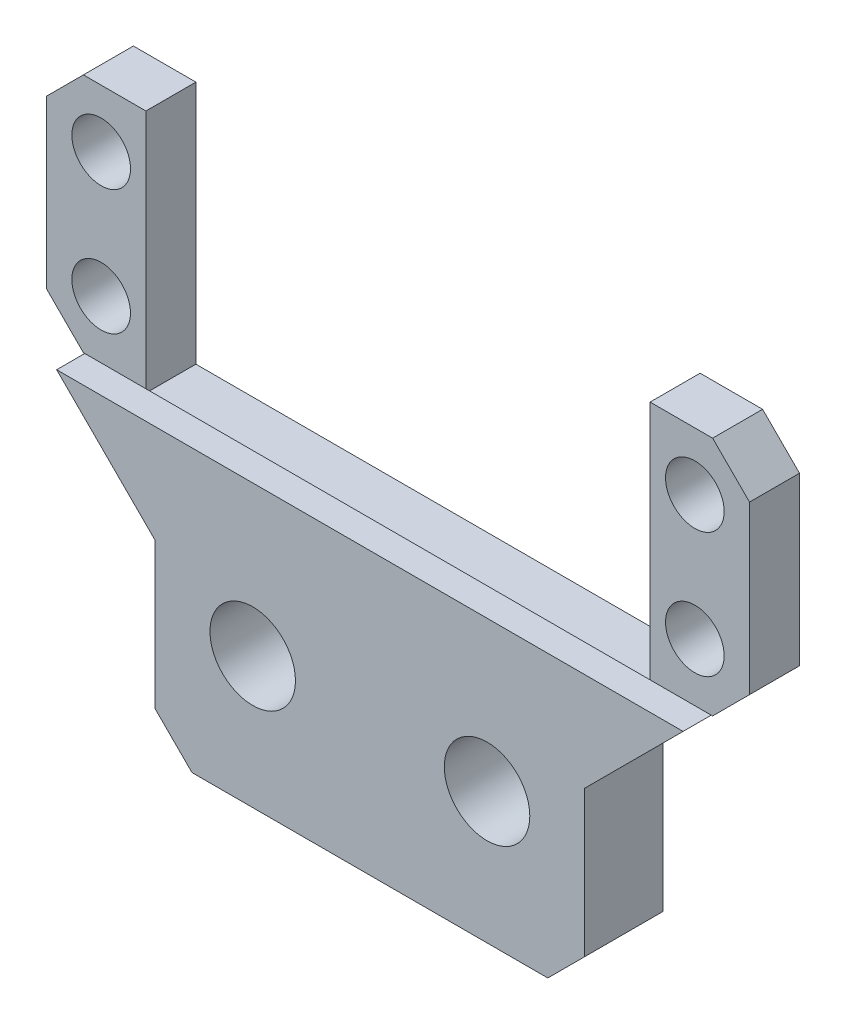
ISO-10303-21;
HEADER;
FILE_DESCRIPTION(('STEP AP214'),'2;1');
FILE_NAME('part.step','',(''),(''),'','','');
FILE_SCHEMA(('AUTOMOTIVE_DESIGN { 1 0 10303 214 1 1 1 1 }'));
ENDSEC;
DATA;
#1=APPLICATION_CONTEXT('core data for automotive mechanical design processes');
#2=APPLICATION_PROTOCOL_DEFINITION('international standard','automotive_design',2000,#1);
#3=PRODUCT_CONTEXT('',#1,'mechanical');
#4=PRODUCT('Part','Part','',(#3));
#5=PRODUCT_RELATED_PRODUCT_CATEGORY('part','',(#4));
#6=PRODUCT_DEFINITION_FORMATION('','',#4);
#7=PRODUCT_DEFINITION_CONTEXT('part definition',#1,'design');
#8=PRODUCT_DEFINITION('design','',#6,#7);
#9=PRODUCT_DEFINITION_SHAPE('','',#8);
#10=(LENGTH_UNIT() NAMED_UNIT(*) SI_UNIT(.MILLI.,.METRE.));
#11=(NAMED_UNIT(*) PLANE_ANGLE_UNIT() SI_UNIT($,.RADIAN.));
#12=(NAMED_UNIT(*) SI_UNIT($,.STERADIAN.) SOLID_ANGLE_UNIT());
#13=UNCERTAINTY_MEASURE_WITH_UNIT(LENGTH_MEASURE(1.E-05),#10,'distance_accuracy_value','');
#14=(GEOMETRIC_REPRESENTATION_CONTEXT(3) GLOBAL_UNCERTAINTY_ASSIGNED_CONTEXT((#13)) GLOBAL_UNIT_ASSIGNED_CONTEXT((#10,
#11,#12)) REPRESENTATION_CONTEXT('',''));
#15=CARTESIAN_POINT('',(0.,0.,0.));
#16=DIRECTION('',(0.,0.,1.));
#17=DIRECTION('',(1.,0.,0.));
#18=AXIS2_PLACEMENT_3D('',#15,#16,#17);
#19=CARTESIAN_POINT('',(0.,21.209,6.35));
#20=DIRECTION('',(0.,-1.,0.));
#21=DIRECTION('',(0.,0.,-1.));
#22=AXIS2_PLACEMENT_3D('',#19,#20,#21);
#23=PLANE('',#22);
#24=DIRECTION('',(-1.,0.,0.));
#25=VECTOR('',#24,1.);
#26=CARTESIAN_POINT('',(25.575,21.209,4.064));
#27=LINE('',#26,#25);
#28=CARTESIAN_POINT('',(-20.493,21.209,4.064));
#29=VERTEX_POINT('',#28);
#30=CARTESIAN_POINT('',(-25.575,21.209,4.064));
#31=VERTEX_POINT('',#30);
#32=EDGE_CURVE('E233',#29,#31,#27,.T.);
#33=ORIENTED_EDGE('',*,*,#32,.F.);
#34=DIRECTION('',(0.,0.,-1.));
#35=VECTOR('',#34,1.);
#36=CARTESIAN_POINT('',(-20.493,21.209,6.35));
#37=LINE('',#36,#35);
#38=CARTESIAN_POINT('',(-20.493,21.209,0.));
#39=VERTEX_POINT('',#38);
#40=EDGE_CURVE('E219',#29,#39,#37,.T.);
#41=ORIENTED_EDGE('',*,*,#40,.T.);
#42=DIRECTION('',(-1.,0.,0.));
#43=VECTOR('',#42,1.);
#44=CARTESIAN_POINT('',(0.,21.209,0.));
#45=LINE('',#44,#43);
#46=CARTESIAN_POINT('',(-25.575,21.209,0.));
#47=VERTEX_POINT('',#46);
#48=EDGE_CURVE('E204',#39,#47,#45,.T.);
#49=ORIENTED_EDGE('',*,*,#48,.T.);
#50=DIRECTION('',(0.,0.,1.));
#51=VECTOR('',#50,1.);
#52=CARTESIAN_POINT('',(-25.575,21.209,6.35));
#53=LINE('',#52,#51);
#54=EDGE_CURVE('E341',#47,#31,#53,.T.);
#55=ORIENTED_EDGE('',*,*,#54,.T.);
#56=EDGE_LOOP('',(#33,#41,#49,#55));
#57=FACE_BOUND('',#56,.T.);
#58=ADVANCED_FACE('F33',(#57),#23,.F.);
#59=CARTESIAN_POINT('',(0.,0.,4.064));
#60=DIRECTION('',(0.,0.,1.));
#61=DIRECTION('',(1.,0.,0.));
#62=AXIS2_PLACEMENT_3D('',#59,#60,#61);
#63=PLANE('',#62);
#64=DIRECTION('',(0.,-1.,0.));
#65=VECTOR('',#64,1.);
#66=CARTESIAN_POINT('',(-20.493,1.35099999999998,4.064));
#67=LINE('',#66,#65);
#68=CARTESIAN_POINT('',(-20.493,1.6509999999999,4.064));
#69=VERTEX_POINT('',#68);
#70=EDGE_CURVE('E48',#29,#69,#67,.T.);
#71=ORIENTED_EDGE('',*,*,#70,.F.);
#72=ORIENTED_EDGE('',*,*,#32,.T.);
#73=DIRECTION('',(-0.707106781186548,-0.707106781186547,0.));
#74=VECTOR('',#73,1.);
#75=CARTESIAN_POINT('',(-25.575,21.209,4.064));
#76=LINE('',#75,#74);
#77=CARTESIAN_POINT('',(-28.575,18.209,4.064));
#78=VERTEX_POINT('',#77);
#79=EDGE_CURVE('E237',#31,#78,#76,.T.);
#80=ORIENTED_EDGE('',*,*,#79,.T.);
#81=DIRECTION('',(0.,-1.,0.));
#82=VECTOR('',#81,1.);
#83=CARTESIAN_POINT('',(-28.575,18.209,4.064));
#84=LINE('',#83,#82);
#85=CARTESIAN_POINT('',(-28.575,4.65099999999999,4.064));
#86=VERTEX_POINT('',#85);
#87=EDGE_CURVE('E239',#78,#86,#84,.T.);
#88=ORIENTED_EDGE('',*,*,#87,.T.);
#89=DIRECTION('',(0.707106781186546,-0.707106781186549,0.));
#90=VECTOR('',#89,1.);
#91=CARTESIAN_POINT('',(-28.575,4.65099999999999,4.064));
#92=LINE('',#91,#90);
#93=CARTESIAN_POINT('',(-25.575,1.65099999999999,4.064));
#94=VERTEX_POINT('',#93);
#95=EDGE_CURVE('E241',#86,#94,#92,.T.);
#96=ORIENTED_EDGE('',*,*,#95,.T.);
#97=DIRECTION('',(1.,0.,0.));
#98=VECTOR('',#97,1.);
#99=CARTESIAN_POINT('',(25.4625,1.65099999999999,4.064));
#100=LINE('',#99,#98);
#101=CARTESIAN_POINT('',(-25.4624999999999,1.65099999999989,4.064));
#102=VERTEX_POINT('',#101);
#103=EDGE_CURVE('E222',#94,#102,#100,.T.);
#104=ORIENTED_EDGE('',*,*,#103,.T.);
#105=EDGE_CURVE('E226',#102,#69,#100,.T.);
#106=ORIENTED_EDGE('',*,*,#105,.T.);
#107=EDGE_LOOP('',(#71,#72,#80,#88,#96,#104,#106));
#108=FACE_BOUND('',#107,.T.);
#109=CARTESIAN_POINT('',(-24.13,16.51,4.064));
#110=DIRECTION('',(0.,0.,1.));
#111=DIRECTION('',(1.,0.,0.));
#112=AXIS2_PLACEMENT_3D('',#109,#110,#111);
#113=CIRCLE('',#112,2.3828);
#114=CARTESIAN_POINT('',(-21.7472,16.51,4.064));
#115=VERTEX_POINT('',#114);
#116=EDGE_CURVE('E251',#115,#115,#113,.F.);
#117=ORIENTED_EDGE('',*,*,#116,.T.);
#118=EDGE_LOOP('',(#117));
#119=FACE_BOUND('',#118,.T.);
#120=CARTESIAN_POINT('',(-24.13,6.34999999999999,4.064));
#121=DIRECTION('',(0.,0.,1.));
#122=DIRECTION('',(1.,0.,0.));
#123=AXIS2_PLACEMENT_3D('',#120,#121,#122);
#124=CIRCLE('',#123,2.3828);
#125=CARTESIAN_POINT('',(-21.7472,6.34999999999999,4.064));
#126=VERTEX_POINT('',#125);
#127=EDGE_CURVE('E254',#126,#126,#124,.T.);
#128=ORIENTED_EDGE('',*,*,#127,.F.);
#129=EDGE_LOOP('',(#128));
#130=FACE_BOUND('',#129,.T.);
#131=ADVANCED_FACE('F415',(#108,#119,#130),#63,.T.);
#132=CARTESIAN_POINT('',(0.,1.65099999999999,6.35));
#133=DIRECTION('',(0.,-1.,0.));
#134=DIRECTION('',(1.,0.,0.));
#135=AXIS2_PLACEMENT_3D('',#132,#133,#134);
#136=PLANE('',#135);
#137=DIRECTION('',(0.,0.,1.));
#138=VECTOR('',#137,1.);
#139=CARTESIAN_POINT('',(-25.4625,1.65099999999999,6.35));
#140=LINE('',#139,#138);
#141=CARTESIAN_POINT('',(-25.4625,1.65099999999999,0.));
#142=VERTEX_POINT('',#141);
#143=EDGE_CURVE('E364',#142,#102,#140,.T.);
#144=ORIENTED_EDGE('',*,*,#143,.T.);
#145=ORIENTED_EDGE('',*,*,#103,.F.);
#146=DIRECTION('',(0.,0.,-1.));
#147=VECTOR('',#146,1.);
#148=CARTESIAN_POINT('',(-25.575,1.65099999999999,6.35));
#149=LINE('',#148,#147);
#150=CARTESIAN_POINT('',(-25.575,1.65099999999999,0.));
#151=VERTEX_POINT('',#150);
#152=EDGE_CURVE('E354',#94,#151,#149,.T.);
#153=ORIENTED_EDGE('',*,*,#152,.T.);
#154=DIRECTION('',(-1.,0.,0.));
#155=VECTOR('',#154,1.);
#156=CARTESIAN_POINT('',(0.,1.65099999999999,0.));
#157=LINE('',#156,#155);
#158=EDGE_CURVE('E283',#142,#151,#157,.T.);
#159=ORIENTED_EDGE('',*,*,#158,.F.);
#160=EDGE_LOOP('',(#144,#145,#153,#159));
#161=FACE_BOUND('',#160,.T.);
#162=ADVANCED_FACE('F394',(#161),#136,.T.);
#163=CARTESIAN_POINT('',(0.,1.651,6.35));
#164=DIRECTION('',(0.,-1.,0.));
#165=DIRECTION('',(1.,0.,0.));
#166=AXIS2_PLACEMENT_3D('',#163,#164,#165);
#167=PLANE('',#166);
#168=DIRECTION('',(0.,0.,1.));
#169=VECTOR('',#168,1.);
#170=CARTESIAN_POINT('',(25.575,1.65099999999999,6.35));
#171=LINE('',#170,#169);
#172=CARTESIAN_POINT('',(25.575,1.65099999999999,0.));
#173=VERTEX_POINT('',#172);
#174=CARTESIAN_POINT('',(25.575,1.65099999999999,4.064));
#175=VERTEX_POINT('',#174);
#176=EDGE_CURVE('E351',#173,#175,#171,.T.);
#177=ORIENTED_EDGE('',*,*,#176,.T.);
#178=CARTESIAN_POINT('',(25.4625,1.65099999999999,4.064));
#179=VERTEX_POINT('',#178);
#180=EDGE_CURVE('E245',#179,#175,#100,.T.);
#181=ORIENTED_EDGE('',*,*,#180,.F.);
#182=DIRECTION('',(0.,0.,-1.));
#183=VECTOR('',#182,1.);
#184=CARTESIAN_POINT('',(25.4625,1.65099999999999,6.35));
#185=LINE('',#184,#183);
#186=CARTESIAN_POINT('',(25.4625,1.65099999999999,0.));
#187=VERTEX_POINT('',#186);
#188=EDGE_CURVE('E367',#179,#187,#185,.T.);
#189=ORIENTED_EDGE('',*,*,#188,.T.);
#190=DIRECTION('',(-1.,0.,0.));
#191=VECTOR('',#190,1.);
#192=CARTESIAN_POINT('',(0.,1.651,0.));
#193=LINE('',#192,#191);
#194=EDGE_CURVE('E294',#173,#187,#193,.T.);
#195=ORIENTED_EDGE('',*,*,#194,.F.);
#196=EDGE_LOOP('',(#177,#181,#189,#195));
#197=FACE_BOUND('',#196,.T.);
#198=ADVANCED_FACE('F433',(#197),#167,.T.);
#199=CARTESIAN_POINT('',(28.575,0.,6.35));
#200=DIRECTION('',(-1.,0.,0.));
#201=DIRECTION('',(0.,0.,1.));
#202=AXIS2_PLACEMENT_3D('',#199,#200,#201);
#203=PLANE('',#202);
#204=DIRECTION('',(0.,1.,0.));
#205=VECTOR('',#204,1.);
#206=CARTESIAN_POINT('',(28.575,4.65099999999998,4.064));
#207=LINE('',#206,#205);
#208=CARTESIAN_POINT('',(28.575,4.65099999999998,4.064));
#209=VERTEX_POINT('',#208);
#210=CARTESIAN_POINT('',(28.575,18.209,4.064));
#211=VERTEX_POINT('',#210);
#212=EDGE_CURVE('E229',#209,#211,#207,.T.);
#213=ORIENTED_EDGE('',*,*,#212,.F.);
#214=DIRECTION('',(0.,0.,-1.));
#215=VECTOR('',#214,1.);
#216=CARTESIAN_POINT('',(28.575,4.65099999999998,0.));
#217=LINE('',#216,#215);
#218=CARTESIAN_POINT('',(28.575,4.65099999999998,0.));
#219=VERTEX_POINT('',#218);
#220=EDGE_CURVE('E346',#209,#219,#217,.T.);
#221=ORIENTED_EDGE('',*,*,#220,.T.);
#222=DIRECTION('',(0.,1.,0.));
#223=VECTOR('',#222,1.);
#224=CARTESIAN_POINT('',(28.575,0.,0.));
#225=LINE('',#224,#223);
#226=CARTESIAN_POINT('',(28.575,18.209,0.));
#227=VERTEX_POINT('',#226);
#228=EDGE_CURVE('E296',#219,#227,#225,.T.);
#229=ORIENTED_EDGE('',*,*,#228,.T.);
#230=DIRECTION('',(0.,0.,1.));
#231=VECTOR('',#230,1.);
#232=CARTESIAN_POINT('',(28.575,18.209,6.35));
#233=LINE('',#232,#231);
#234=EDGE_CURVE('E348',#227,#211,#233,.T.);
#235=ORIENTED_EDGE('',*,*,#234,.T.);
#236=EDGE_LOOP('',(#213,#221,#229,#235));
#237=FACE_BOUND('',#236,.T.);
#238=ADVANCED_FACE('F445',(#237),#203,.F.);
#239=CARTESIAN_POINT('',(25.575,21.209,0.));
#240=VERTEX_POINT('',#239);
#241=CARTESIAN_POINT('',(20.493,21.209,0.));
#242=VERTEX_POINT('',#241);
#243=EDGE_CURVE('E299',#240,#242,#45,.T.);
#244=ORIENTED_EDGE('',*,*,#243,.T.);
#245=DIRECTION('',(0.,0.,1.));
#246=VECTOR('',#245,1.);
#247=CARTESIAN_POINT('',(20.493,21.209,6.35));
#248=LINE('',#247,#246);
#249=CARTESIAN_POINT('',(20.493,21.209,4.064));
#250=VERTEX_POINT('',#249);
#251=EDGE_CURVE('E215',#242,#250,#248,.T.);
#252=ORIENTED_EDGE('',*,*,#251,.T.);
#253=CARTESIAN_POINT('',(25.575,21.209,4.064));
#254=VERTEX_POINT('',#253);
#255=EDGE_CURVE('E234',#254,#250,#27,.T.);
#256=ORIENTED_EDGE('',*,*,#255,.F.);
#257=DIRECTION('',(0.,0.,-1.));
#258=VECTOR('',#257,1.);
#259=CARTESIAN_POINT('',(25.575,21.209,6.35));
#260=LINE('',#259,#258);
#261=EDGE_CURVE('E344',#254,#240,#260,.T.);
#262=ORIENTED_EDGE('',*,*,#261,.T.);
#263=EDGE_LOOP('',(#244,#252,#256,#262));
#264=FACE_BOUND('',#263,.T.);
#265=ADVANCED_FACE('F454',(#264),#23,.F.);
#266=CARTESIAN_POINT('',(24.13,16.51,6.35));
#267=DIRECTION('',(0.,0.,-1.));
#268=DIRECTION('',(-1.,0.,0.));
#269=AXIS2_PLACEMENT_3D('',#266,#267,#268);
#270=CYLINDRICAL_SURFACE('',#269,2.3828);
#271=CARTESIAN_POINT('',(24.13,16.51,0.));
#272=DIRECTION('',(0.,0.,1.));
#273=DIRECTION('',(1.,0.,0.));
#274=AXIS2_PLACEMENT_3D('',#271,#272,#273);
#275=CIRCLE('',#274,2.3828);
#276=CARTESIAN_POINT('',(26.5128,16.51,0.));
#277=VERTEX_POINT('',#276);
#278=EDGE_CURVE('E311',#277,#277,#275,.T.);
#279=ORIENTED_EDGE('',*,*,#278,.F.);
#280=EDGE_LOOP('',(#279));
#281=FACE_BOUND('',#280,.T.);
#282=CARTESIAN_POINT('',(24.13,16.51,4.064));
#283=DIRECTION('',(0.,0.,1.));
#284=DIRECTION('',(1.,0.,0.));
#285=AXIS2_PLACEMENT_3D('',#282,#283,#284);
#286=CIRCLE('',#285,2.3828);
#287=CARTESIAN_POINT('',(26.5128,16.51,4.064));
#288=VERTEX_POINT('',#287);
#289=EDGE_CURVE('E257',#288,#288,#286,.T.);
#290=ORIENTED_EDGE('',*,*,#289,.T.);
#291=EDGE_LOOP('',(#290));
#292=FACE_BOUND('',#291,.T.);
#293=ADVANCED_FACE('F477',(#281,#292),#270,.F.);
#294=CARTESIAN_POINT('',(-28.575,0.,6.35));
#295=DIRECTION('',(-1.,0.,0.));
#296=DIRECTION('',(0.,0.,1.));
#297=AXIS2_PLACEMENT_3D('',#294,#295,#296);
#298=PLANE('',#297);
#299=DIRECTION('',(0.,0.,1.));
#300=VECTOR('',#299,1.);
#301=CARTESIAN_POINT('',(-28.575,4.65099999999999,6.35));
#302=LINE('',#301,#300);
#303=CARTESIAN_POINT('',(-28.575,4.65099999999999,0.));
#304=VERTEX_POINT('',#303);
#305=EDGE_CURVE('E358',#304,#86,#302,.T.);
#306=ORIENTED_EDGE('',*,*,#305,.T.);
#307=ORIENTED_EDGE('',*,*,#87,.F.);
#308=DIRECTION('',(0.,0.,-1.));
#309=VECTOR('',#308,1.);
#310=CARTESIAN_POINT('',(-28.575,18.209,0.));
#311=LINE('',#310,#309);
#312=CARTESIAN_POINT('',(-28.575,18.209,0.));
#313=VERTEX_POINT('',#312);
#314=EDGE_CURVE('E356',#78,#313,#311,.T.);
#315=ORIENTED_EDGE('',*,*,#314,.T.);
#316=DIRECTION('',(0.,1.,0.));
#317=VECTOR('',#316,1.);
#318=CARTESIAN_POINT('',(-28.575,0.,0.));
#319=LINE('',#318,#317);
#320=EDGE_CURVE('E302',#304,#313,#319,.T.);
#321=ORIENTED_EDGE('',*,*,#320,.F.);
#322=EDGE_LOOP('',(#306,#307,#315,#321));
#323=FACE_BOUND('',#322,.T.);
#324=ADVANCED_FACE('F403',(#323),#298,.T.);
#325=CARTESIAN_POINT('',(-24.13,6.34999999999999,6.35));
#326=DIRECTION('',(0.,0.,-1.));
#327=DIRECTION('',(-1.,0.,0.));
#328=AXIS2_PLACEMENT_3D('',#325,#326,#327);
#329=CYLINDRICAL_SURFACE('',#328,2.3828);
#330=CARTESIAN_POINT('',(-24.13,6.34999999999999,0.));
#331=DIRECTION('',(0.,0.,1.));
#332=DIRECTION('',(1.,0.,0.));
#333=AXIS2_PLACEMENT_3D('',#330,#331,#332);
#334=CIRCLE('',#333,2.3828);
#335=CARTESIAN_POINT('',(-21.7472,6.34999999999999,0.));
#336=VERTEX_POINT('',#335);
#337=EDGE_CURVE('E280',#336,#336,#334,.T.);
#338=ORIENTED_EDGE('',*,*,#337,.F.);
#339=EDGE_LOOP('',(#338));
#340=FACE_BOUND('',#339,.T.);
#341=ORIENTED_EDGE('',*,*,#127,.T.);
#342=EDGE_LOOP('',(#341));
#343=FACE_BOUND('',#342,.T.);
#344=ADVANCED_FACE('F502',(#340,#343),#329,.F.);
#345=CARTESIAN_POINT('',(-24.13,16.51,6.35));
#346=DIRECTION('',(0.,0.,-1.));
#347=DIRECTION('',(-1.,0.,0.));
#348=AXIS2_PLACEMENT_3D('',#345,#346,#347);
#349=CYLINDRICAL_SURFACE('',#348,2.3828);
#350=CARTESIAN_POINT('',(-24.13,16.51,0.));
#351=DIRECTION('',(0.,0.,1.));
#352=DIRECTION('',(1.,0.,0.));
#353=AXIS2_PLACEMENT_3D('',#350,#351,#352);
#354=CIRCLE('',#353,2.3828);
#355=CARTESIAN_POINT('',(-21.7472,16.51,0.));
#356=VERTEX_POINT('',#355);
#357=EDGE_CURVE('E260',#356,#356,#354,.F.);
#358=ORIENTED_EDGE('',*,*,#357,.T.);
#359=EDGE_LOOP('',(#358));
#360=FACE_BOUND('',#359,.T.);
#361=ORIENTED_EDGE('',*,*,#116,.F.);
#362=EDGE_LOOP('',(#361));
#363=FACE_BOUND('',#362,.T.);
#364=ADVANCED_FACE('F505',(#360,#363),#349,.F.);
#365=CARTESIAN_POINT('',(24.13,6.34999999999999,6.35));
#366=DIRECTION('',(0.,0.,-1.));
#367=DIRECTION('',(-1.,0.,0.));
#368=AXIS2_PLACEMENT_3D('',#365,#366,#367);
#369=CYLINDRICAL_SURFACE('',#368,2.3828);
#370=CARTESIAN_POINT('',(24.13,6.34999999999999,0.));
#371=DIRECTION('',(0.,0.,1.));
#372=DIRECTION('',(1.,0.,0.));
#373=AXIS2_PLACEMENT_3D('',#370,#371,#372);
#374=CIRCLE('',#373,2.3828);
#375=CARTESIAN_POINT('',(26.5128,6.34999999999999,0.));
#376=VERTEX_POINT('',#375);
#377=EDGE_CURVE('E265',#376,#376,#374,.F.);
#378=ORIENTED_EDGE('',*,*,#377,.T.);
#379=EDGE_LOOP('',(#378));
#380=FACE_BOUND('',#379,.T.);
#381=CARTESIAN_POINT('',(24.13,6.34999999999999,4.064));
#382=DIRECTION('',(0.,0.,1.));
#383=DIRECTION('',(1.,0.,0.));
#384=AXIS2_PLACEMENT_3D('',#381,#382,#383);
#385=CIRCLE('',#384,2.3828);
#386=CARTESIAN_POINT('',(26.5128,6.34999999999999,4.064));
#387=VERTEX_POINT('',#386);
#388=EDGE_CURVE('E248',#387,#387,#385,.F.);
#389=ORIENTED_EDGE('',*,*,#388,.F.);
#390=EDGE_LOOP('',(#389));
#391=FACE_BOUND('',#390,.T.);
#392=ADVANCED_FACE('F509',(#380,#391),#369,.F.);
#393=CARTESIAN_POINT('',(25.575,21.209,6.35));
#394=DIRECTION('',(-0.707106781186548,-0.707106781186547,0.));
#395=DIRECTION('',(0.,0.,-1.));
#396=AXIS2_PLACEMENT_3D('',#393,#394,#395);
#397=PLANE('',#396);
#398=ORIENTED_EDGE('',*,*,#261,.F.);
#399=DIRECTION('',(-0.707106781186547,0.707106781186548,0.));
#400=VECTOR('',#399,1.);
#401=CARTESIAN_POINT('',(28.575,18.209,4.064));
#402=LINE('',#401,#400);
#403=EDGE_CURVE('E231',#211,#254,#402,.T.);
#404=ORIENTED_EDGE('',*,*,#403,.F.);
#405=ORIENTED_EDGE('',*,*,#234,.F.);
#406=DIRECTION('',(-0.707106781186547,0.707106781186548,0.));
#407=VECTOR('',#406,1.);
#408=CARTESIAN_POINT('',(25.575,21.209,0.));
#409=LINE('',#408,#407);
#410=EDGE_CURVE('E326',#240,#227,#409,.F.);
#411=ORIENTED_EDGE('',*,*,#410,.F.);
#412=EDGE_LOOP('',(#398,#404,#405,#411));
#413=FACE_BOUND('',#412,.T.);
#414=ADVANCED_FACE('F450',(#413),#397,.F.);
#415=CARTESIAN_POINT('',(28.575,4.65099999999998,6.35));
#416=DIRECTION('',(0.707106781186545,-0.70710678118655,0.));
#417=DIRECTION('',(0.,0.,1.));
#418=AXIS2_PLACEMENT_3D('',#415,#416,#417);
#419=PLANE('',#418);
#420=ORIENTED_EDGE('',*,*,#220,.F.);
#421=DIRECTION('',(0.70710678118655,0.707106781186545,0.));
#422=VECTOR('',#421,1.);
#423=CARTESIAN_POINT('',(25.575,1.65099999999999,4.064));
#424=LINE('',#423,#422);
#425=EDGE_CURVE('E225',#175,#209,#424,.T.);
#426=ORIENTED_EDGE('',*,*,#425,.F.);
#427=ORIENTED_EDGE('',*,*,#176,.F.);
#428=DIRECTION('',(-0.70710678118655,-0.707106781186545,0.));
#429=VECTOR('',#428,1.);
#430=CARTESIAN_POINT('',(28.575,4.65099999999998,0.));
#431=LINE('',#430,#429);
#432=EDGE_CURVE('E324',#219,#173,#431,.T.);
#433=ORIENTED_EDGE('',*,*,#432,.F.);
#434=EDGE_LOOP('',(#420,#426,#427,#433));
#435=FACE_BOUND('',#434,.T.);
#436=ADVANCED_FACE('F441',(#435),#419,.T.);
#437=CARTESIAN_POINT('',(-25.575,1.65099999999999,6.35));
#438=DIRECTION('',(0.707106781186549,0.707106781186546,0.));
#439=DIRECTION('',(0.,0.,-1.));
#440=AXIS2_PLACEMENT_3D('',#437,#438,#439);
#441=PLANE('',#440);
#442=ORIENTED_EDGE('',*,*,#152,.F.);
#443=ORIENTED_EDGE('',*,*,#95,.F.);
#444=ORIENTED_EDGE('',*,*,#305,.F.);
#445=DIRECTION('',(0.707106781186546,-0.707106781186549,0.));
#446=VECTOR('',#445,1.);
#447=CARTESIAN_POINT('',(-25.575,1.65099999999999,0.));
#448=LINE('',#447,#446);
#449=EDGE_CURVE('E322',#151,#304,#448,.F.);
#450=ORIENTED_EDGE('',*,*,#449,.F.);
#451=EDGE_LOOP('',(#442,#443,#444,#450));
#452=FACE_BOUND('',#451,.T.);
#453=ADVANCED_FACE('F399',(#452),#441,.F.);
#454=CARTESIAN_POINT('',(-28.575,18.209,6.35));
#455=DIRECTION('',(-0.707106781186547,0.707106781186548,0.));
#456=DIRECTION('',(0.,0.,1.));
#457=AXIS2_PLACEMENT_3D('',#454,#455,#456);
#458=PLANE('',#457);
#459=ORIENTED_EDGE('',*,*,#314,.F.);
#460=ORIENTED_EDGE('',*,*,#79,.F.);
#461=ORIENTED_EDGE('',*,*,#54,.F.);
#462=DIRECTION('',(0.707106781186548,0.707106781186547,0.));
#463=VECTOR('',#462,1.);
#464=CARTESIAN_POINT('',(-28.575,18.209,0.));
#465=LINE('',#464,#463);
#466=EDGE_CURVE('E320',#313,#47,#465,.T.);
#467=ORIENTED_EDGE('',*,*,#466,.F.);
#468=EDGE_LOOP('',(#459,#460,#461,#467));
#469=FACE_BOUND('',#468,.T.);
#470=ADVANCED_FACE('F410',(#469),#458,.T.);
#471=CARTESIAN_POINT('',(-17.4625,0.,6.35));
#472=DIRECTION('',(-1.,0.,0.));
#473=DIRECTION('',(0.,0.,1.));
#474=AXIS2_PLACEMENT_3D('',#471,#472,#473);
#475=PLANE('',#474);
#476=DIRECTION('',(0.,1.,0.));
#477=VECTOR('',#476,1.);
#478=CARTESIAN_POINT('',(-17.4625,0.,6.35));
#479=LINE('',#478,#477);
#480=CARTESIAN_POINT('',(-17.4625,-18.209,6.35));
#481=VERTEX_POINT('',#480);
#482=CARTESIAN_POINT('',(-17.4625,-6.34900000000007,6.35));
#483=VERTEX_POINT('',#482);
#484=EDGE_CURVE('E261',#481,#483,#479,.T.);
#485=ORIENTED_EDGE('',*,*,#484,.T.);
#486=DIRECTION('',(0.,0.,-1.));
#487=VECTOR('',#486,1.);
#488=CARTESIAN_POINT('',(-17.4625,-6.34900000000007,0.));
#489=LINE('',#488,#487);
#490=CARTESIAN_POINT('',(-17.4625,-6.34900000000007,0.));
#491=VERTEX_POINT('',#490);
#492=EDGE_CURVE('E361',#483,#491,#489,.T.);
#493=ORIENTED_EDGE('',*,*,#492,.T.);
#494=DIRECTION('',(0.,1.,0.));
#495=VECTOR('',#494,1.);
#496=CARTESIAN_POINT('',(-17.4625,0.,0.));
#497=LINE('',#496,#495);
#498=CARTESIAN_POINT('',(-17.4625,-18.209,0.));
#499=VERTEX_POINT('',#498);
#500=EDGE_CURVE('E286',#499,#491,#497,.T.);
#501=ORIENTED_EDGE('',*,*,#500,.F.);
#502=DIRECTION('',(0.,0.,1.));
#503=VECTOR('',#502,1.);
#504=CARTESIAN_POINT('',(-17.4625,-18.209,6.35));
#505=LINE('',#504,#503);
#506=EDGE_CURVE('E332',#499,#481,#505,.T.);
#507=ORIENTED_EDGE('',*,*,#506,.T.);
#508=EDGE_LOOP('',(#485,#493,#501,#507));
#509=FACE_BOUND('',#508,.T.);
#510=ADVANCED_FACE('F386',(#509),#475,.T.);
#511=CARTESIAN_POINT('',(0.,-21.209,6.35));
#512=DIRECTION('',(0.,-1.,0.));
#513=DIRECTION('',(1.,0.,0.));
#514=AXIS2_PLACEMENT_3D('',#511,#512,#513);
#515=PLANE('',#514);
#516=DIRECTION('',(-1.,0.,0.));
#517=VECTOR('',#516,1.);
#518=CARTESIAN_POINT('',(0.,-21.209,6.35));
#519=LINE('',#518,#517);
#520=CARTESIAN_POINT('',(14.4625,-21.209,6.35));
#521=VERTEX_POINT('',#520);
#522=CARTESIAN_POINT('',(-14.4625,-21.209,6.35));
#523=VERTEX_POINT('',#522);
#524=EDGE_CURVE('E264',#521,#523,#519,.T.);
#525=ORIENTED_EDGE('',*,*,#524,.T.);
#526=DIRECTION('',(0.,0.,-1.));
#527=VECTOR('',#526,1.);
#528=CARTESIAN_POINT('',(-14.4625,-21.209,6.35));
#529=LINE('',#528,#527);
#530=CARTESIAN_POINT('',(-14.4625,-21.209,0.));
#531=VERTEX_POINT('',#530);
#532=EDGE_CURVE('E317',#523,#531,#529,.T.);
#533=ORIENTED_EDGE('',*,*,#532,.T.);
#534=DIRECTION('',(-1.,0.,0.));
#535=VECTOR('',#534,1.);
#536=CARTESIAN_POINT('',(0.,-21.209,0.));
#537=LINE('',#536,#535);
#538=CARTESIAN_POINT('',(14.4625,-21.209,0.));
#539=VERTEX_POINT('',#538);
#540=EDGE_CURVE('E289',#539,#531,#537,.T.);
#541=ORIENTED_EDGE('',*,*,#540,.F.);
#542=DIRECTION('',(0.,0.,1.));
#543=VECTOR('',#542,1.);
#544=CARTESIAN_POINT('',(14.4625,-21.209,6.35));
#545=LINE('',#544,#543);
#546=EDGE_CURVE('E277',#539,#521,#545,.T.);
#547=ORIENTED_EDGE('',*,*,#546,.T.);
#548=EDGE_LOOP('',(#525,#533,#541,#547));
#549=FACE_BOUND('',#548,.T.);
#550=ADVANCED_FACE('F493',(#549),#515,.T.);
#551=CARTESIAN_POINT('',(17.4625,0.,6.35));
#552=DIRECTION('',(-1.,0.,0.));
#553=DIRECTION('',(0.,-1.,0.));
#554=AXIS2_PLACEMENT_3D('',#551,#552,#553);
#555=PLANE('',#554);
#556=DIRECTION('',(0.,1.,0.));
#557=VECTOR('',#556,1.);
#558=CARTESIAN_POINT('',(17.4625,0.,0.));
#559=LINE('',#558,#557);
#560=CARTESIAN_POINT('',(17.4625,-18.209,0.));
#561=VERTEX_POINT('',#560);
#562=CARTESIAN_POINT('',(17.4625,-6.34899999999999,0.));
#563=VERTEX_POINT('',#562);
#564=EDGE_CURVE('E292',#561,#563,#559,.T.);
#565=ORIENTED_EDGE('',*,*,#564,.T.);
#566=DIRECTION('',(0.,0.,1.));
#567=VECTOR('',#566,1.);
#568=CARTESIAN_POINT('',(17.4625,-6.34899999999999,6.35));
#569=LINE('',#568,#567);
#570=CARTESIAN_POINT('',(17.4625,-6.34899999999999,6.35));
#571=VERTEX_POINT('',#570);
#572=EDGE_CURVE('E371',#563,#571,#569,.T.);
#573=ORIENTED_EDGE('',*,*,#572,.T.);
#574=DIRECTION('',(0.,1.,0.));
#575=VECTOR('',#574,1.);
#576=CARTESIAN_POINT('',(17.4625,0.,6.35));
#577=LINE('',#576,#575);
#578=CARTESIAN_POINT('',(17.4625,-18.209,6.35));
#579=VERTEX_POINT('',#578);
#580=EDGE_CURVE('E268',#579,#571,#577,.T.);
#581=ORIENTED_EDGE('',*,*,#580,.F.);
#582=DIRECTION('',(0.,0.,-1.));
#583=VECTOR('',#582,1.);
#584=CARTESIAN_POINT('',(17.4625,-18.209,0.));
#585=LINE('',#584,#583);
#586=EDGE_CURVE('E338',#579,#561,#585,.T.);
#587=ORIENTED_EDGE('',*,*,#586,.T.);
#588=EDGE_LOOP('',(#565,#573,#581,#587));
#589=FACE_BOUND('',#588,.T.);
#590=ADVANCED_FACE('F489',(#589),#555,.F.);
#591=CARTESIAN_POINT('',(9.52500000000002,-10.541,6.35));
#592=DIRECTION('',(0.,0.,-1.));
#593=DIRECTION('',(-1.,0.,0.));
#594=AXIS2_PLACEMENT_3D('',#591,#592,#593);
#595=CYLINDRICAL_SURFACE('',#594,3.475);
#596=CARTESIAN_POINT('',(9.52500000000002,-10.541,6.35));
#597=DIRECTION('',(0.,0.,1.));
#598=DIRECTION('',(1.,0.,0.));
#599=AXIS2_PLACEMENT_3D('',#596,#597,#598);
#600=CIRCLE('',#599,3.475);
#601=CARTESIAN_POINT('',(13.,-10.541,6.35));
#602=VERTEX_POINT('',#601);
#603=EDGE_CURVE('E274',#602,#602,#600,.F.);
#604=ORIENTED_EDGE('',*,*,#603,.F.);
#605=EDGE_LOOP('',(#604));
#606=FACE_BOUND('',#605,.T.);
#607=CARTESIAN_POINT('',(9.52500000000002,-10.541,0.));
#608=DIRECTION('',(0.,0.,1.));
#609=DIRECTION('',(1.,0.,0.));
#610=AXIS2_PLACEMENT_3D('',#607,#608,#609);
#611=CIRCLE('',#610,3.475);
#612=CARTESIAN_POINT('',(13.,-10.541,0.));
#613=VERTEX_POINT('',#612);
#614=EDGE_CURVE('E308',#613,#613,#611,.F.);
#615=ORIENTED_EDGE('',*,*,#614,.T.);
#616=EDGE_LOOP('',(#615));
#617=FACE_BOUND('',#616,.T.);
#618=ADVANCED_FACE('F492',(#606,#617),#595,.F.);
#619=CARTESIAN_POINT('',(-9.525,-10.541,6.35));
#620=DIRECTION('',(0.,0.,-1.));
#621=DIRECTION('',(-1.,0.,0.));
#622=AXIS2_PLACEMENT_3D('',#619,#620,#621);
#623=CYLINDRICAL_SURFACE('',#622,3.475);
#624=CARTESIAN_POINT('',(-9.525,-10.541,6.35));
#625=DIRECTION('',(0.,0.,1.));
#626=DIRECTION('',(1.,0.,0.));
#627=AXIS2_PLACEMENT_3D('',#624,#625,#626);
#628=CIRCLE('',#627,3.475);
#629=CARTESIAN_POINT('',(-6.05,-10.541,6.35));
#630=VERTEX_POINT('',#629);
#631=EDGE_CURVE('E271',#630,#630,#628,.T.);
#632=ORIENTED_EDGE('',*,*,#631,.T.);
#633=EDGE_LOOP('',(#632));
#634=FACE_BOUND('',#633,.T.);
#635=CARTESIAN_POINT('',(-9.525,-10.541,0.));
#636=DIRECTION('',(0.,0.,1.));
#637=DIRECTION('',(1.,0.,0.));
#638=AXIS2_PLACEMENT_3D('',#635,#636,#637);
#639=CIRCLE('',#638,3.475);
#640=CARTESIAN_POINT('',(-6.05,-10.541,0.));
#641=VERTEX_POINT('',#640);
#642=EDGE_CURVE('E305',#641,#641,#639,.T.);
#643=ORIENTED_EDGE('',*,*,#642,.F.);
#644=EDGE_LOOP('',(#643));
#645=FACE_BOUND('',#644,.T.);
#646=ADVANCED_FACE('F541',(#634,#645),#623,.F.);
#647=CARTESIAN_POINT('',(0.,0.,6.35));
#648=DIRECTION('',(0.,0.,1.));
#649=DIRECTION('',(1.,0.,0.));
#650=AXIS2_PLACEMENT_3D('',#647,#648,#649);
#651=PLANE('',#650);
#652=DIRECTION('',(1.,0.,0.));
#653=VECTOR('',#652,1.);
#654=CARTESIAN_POINT('',(-25.4625,1.65099999999999,6.35));
#655=LINE('',#654,#653);
#656=CARTESIAN_POINT('',(-25.4625,1.65099999999999,6.35));
#657=VERTEX_POINT('',#656);
#658=CARTESIAN_POINT('',(25.4625,1.65099999999999,6.35));
#659=VERTEX_POINT('',#658);
#660=EDGE_CURVE('E221',#657,#659,#655,.T.);
#661=ORIENTED_EDGE('',*,*,#660,.F.);
#662=DIRECTION('',(-0.707106781186544,0.707106781186551,0.));
#663=VECTOR('',#662,1.);
#664=CARTESIAN_POINT('',(-17.4625,-6.34900000000007,6.35));
#665=LINE('',#664,#663);
#666=EDGE_CURVE('E375',#657,#483,#665,.F.);
#667=ORIENTED_EDGE('',*,*,#666,.T.);
#668=ORIENTED_EDGE('',*,*,#484,.F.);
#669=DIRECTION('',(-0.707106781186546,0.707106781186549,0.));
#670=VECTOR('',#669,1.);
#671=CARTESIAN_POINT('',(-17.83575,-17.83575,6.35));
#672=LINE('',#671,#670);
#673=EDGE_CURVE('E336',#481,#523,#672,.F.);
#674=ORIENTED_EDGE('',*,*,#673,.T.);
#675=ORIENTED_EDGE('',*,*,#524,.F.);
#676=DIRECTION('',(0.707106781186548,0.707106781186547,0.));
#677=VECTOR('',#676,1.);
#678=CARTESIAN_POINT('',(17.83575,-17.83575,6.35));
#679=LINE('',#678,#677);
#680=EDGE_CURVE('E334',#521,#579,#679,.T.);
#681=ORIENTED_EDGE('',*,*,#680,.T.);
#682=ORIENTED_EDGE('',*,*,#580,.T.);
#683=DIRECTION('',(0.707106781186551,0.707106781186544,0.));
#684=VECTOR('',#683,1.);
#685=CARTESIAN_POINT('',(25.4625,1.65099999999999,6.35));
#686=LINE('',#685,#684);
#687=EDGE_CURVE('E11',#571,#659,#686,.T.);
#688=ORIENTED_EDGE('',*,*,#687,.T.);
#689=EDGE_LOOP('',(#661,#667,#668,#674,#675,#681,#682,#688));
#690=FACE_BOUND('',#689,.T.);
#691=ORIENTED_EDGE('',*,*,#631,.F.);
#692=EDGE_LOOP('',(#691));
#693=FACE_BOUND('',#692,.T.);
#694=ORIENTED_EDGE('',*,*,#603,.T.);
#695=EDGE_LOOP('',(#694));
#696=FACE_BOUND('',#695,.T.);
#697=ADVANCED_FACE('F380',(#690,#693,#696),#651,.T.);
#698=CARTESIAN_POINT('',(0.,0.,0.));
#699=DIRECTION('',(0.,0.,1.));
#700=DIRECTION('',(1.,0.,0.));
#701=AXIS2_PLACEMENT_3D('',#698,#699,#700);
#702=PLANE('',#701);
#703=ORIENTED_EDGE('',*,*,#48,.F.);
#704=DIRECTION('',(0.,-1.,0.));
#705=VECTOR('',#704,1.);
#706=CARTESIAN_POINT('',(-20.493,1.35099999999998,0.));
#707=LINE('',#706,#705);
#708=CARTESIAN_POINT('',(-20.493,1.35099999999998,0.));
#709=VERTEX_POINT('',#708);
#710=EDGE_CURVE('E185',#39,#709,#707,.T.);
#711=ORIENTED_EDGE('',*,*,#710,.T.);
#712=DIRECTION('',(1.,0.,0.));
#713=VECTOR('',#712,1.);
#714=CARTESIAN_POINT('',(20.493,1.35099999999998,0.));
#715=LINE('',#714,#713);
#716=CARTESIAN_POINT('',(20.493,1.35099999999998,0.));
#717=VERTEX_POINT('',#716);
#718=EDGE_CURVE('E195',#709,#717,#715,.T.);
#719=ORIENTED_EDGE('',*,*,#718,.T.);
#720=DIRECTION('',(0.,1.,0.));
#721=VECTOR('',#720,1.);
#722=CARTESIAN_POINT('',(20.493,1.35099999999998,0.));
#723=LINE('',#722,#721);
#724=EDGE_CURVE('E192',#717,#242,#723,.T.);
#725=ORIENTED_EDGE('',*,*,#724,.T.);
#726=ORIENTED_EDGE('',*,*,#243,.F.);
#727=ORIENTED_EDGE('',*,*,#410,.T.);
#728=ORIENTED_EDGE('',*,*,#228,.F.);
#729=ORIENTED_EDGE('',*,*,#432,.T.);
#730=ORIENTED_EDGE('',*,*,#194,.T.);
#731=DIRECTION('',(-0.707106781186551,-0.707106781186544,0.));
#732=VECTOR('',#731,1.);
#733=CARTESIAN_POINT('',(11.9057499999999,-11.90575,0.));
#734=LINE('',#733,#732);
#735=EDGE_CURVE('E41',#187,#563,#734,.T.);
#736=ORIENTED_EDGE('',*,*,#735,.T.);
#737=ORIENTED_EDGE('',*,*,#564,.F.);
#738=DIRECTION('',(-0.707106781186548,-0.707106781186547,0.));
#739=VECTOR('',#738,1.);
#740=CARTESIAN_POINT('',(17.4625,-18.209,0.));
#741=LINE('',#740,#739);
#742=EDGE_CURVE('E328',#561,#539,#741,.T.);
#743=ORIENTED_EDGE('',*,*,#742,.T.);
#744=ORIENTED_EDGE('',*,*,#540,.T.);
#745=DIRECTION('',(0.707106781186546,-0.707106781186549,0.));
#746=VECTOR('',#745,1.);
#747=CARTESIAN_POINT('',(-14.4625,-21.209,0.));
#748=LINE('',#747,#746);
#749=EDGE_CURVE('E330',#531,#499,#748,.F.);
#750=ORIENTED_EDGE('',*,*,#749,.T.);
#751=ORIENTED_EDGE('',*,*,#500,.T.);
#752=DIRECTION('',(0.707106781186544,-0.707106781186551,0.));
#753=VECTOR('',#752,1.);
#754=CARTESIAN_POINT('',(-11.9057500000001,-11.90575,0.));
#755=LINE('',#754,#753);
#756=EDGE_CURVE('E373',#491,#142,#755,.F.);
#757=ORIENTED_EDGE('',*,*,#756,.T.);
#758=ORIENTED_EDGE('',*,*,#158,.T.);
#759=ORIENTED_EDGE('',*,*,#449,.T.);
#760=ORIENTED_EDGE('',*,*,#320,.T.);
#761=ORIENTED_EDGE('',*,*,#466,.T.);
#762=EDGE_LOOP('',(#703,#711,#719,#725,#726,#727,#728,#729,#730,#736,#737,#743,#744,#750,#751,
#757,#758,#759,#760,#761));
#763=FACE_BOUND('',#762,.T.);
#764=ORIENTED_EDGE('',*,*,#357,.F.);
#765=EDGE_LOOP('',(#764));
#766=FACE_BOUND('',#765,.T.);
#767=ORIENTED_EDGE('',*,*,#337,.T.);
#768=EDGE_LOOP('',(#767));
#769=FACE_BOUND('',#768,.T.);
#770=ORIENTED_EDGE('',*,*,#642,.T.);
#771=EDGE_LOOP('',(#770));
#772=FACE_BOUND('',#771,.T.);
#773=ORIENTED_EDGE('',*,*,#614,.F.);
#774=EDGE_LOOP('',(#773));
#775=FACE_BOUND('',#774,.T.);
#776=ORIENTED_EDGE('',*,*,#278,.T.);
#777=EDGE_LOOP('',(#776));
#778=FACE_BOUND('',#777,.T.);
#779=ORIENTED_EDGE('',*,*,#377,.F.);
#780=EDGE_LOOP('',(#779));
#781=FACE_BOUND('',#780,.T.);
#782=ADVANCED_FACE('F201',(#763,#766,#769,#772,#775,#778,#781),#702,.F.);
#783=CARTESIAN_POINT('',(-14.4625,-21.209,6.35));
#784=DIRECTION('',(0.707106781186549,0.707106781186546,0.));
#785=DIRECTION('',(0.,0.,-1.));
#786=AXIS2_PLACEMENT_3D('',#783,#784,#785);
#787=PLANE('',#786);
#788=ORIENTED_EDGE('',*,*,#673,.F.);
#789=ORIENTED_EDGE('',*,*,#506,.F.);
#790=ORIENTED_EDGE('',*,*,#749,.F.);
#791=ORIENTED_EDGE('',*,*,#532,.F.);
#792=EDGE_LOOP('',(#788,#789,#790,#791));
#793=FACE_BOUND('',#792,.T.);
#794=ADVANCED_FACE('F511',(#793),#787,.F.);
#795=CARTESIAN_POINT('',(17.4625,-18.209,6.35));
#796=DIRECTION('',(0.707106781186547,-0.707106781186548,0.));
#797=DIRECTION('',(0.,0.,1.));
#798=AXIS2_PLACEMENT_3D('',#795,#796,#797);
#799=PLANE('',#798);
#800=ORIENTED_EDGE('',*,*,#680,.F.);
#801=ORIENTED_EDGE('',*,*,#546,.F.);
#802=ORIENTED_EDGE('',*,*,#742,.F.);
#803=ORIENTED_EDGE('',*,*,#586,.F.);
#804=EDGE_LOOP('',(#800,#801,#802,#803));
#805=FACE_BOUND('',#804,.T.);
#806=ADVANCED_FACE('F514',(#805),#799,.T.);
#807=CARTESIAN_POINT('',(-17.4625,-6.34900000000007,6.35));
#808=DIRECTION('',(-0.707106781186551,-0.707106781186544,0.));
#809=DIRECTION('',(0.,0.,1.));
#810=AXIS2_PLACEMENT_3D('',#807,#808,#809);
#811=PLANE('',#810);
#812=ORIENTED_EDGE('',*,*,#666,.F.);
#813=DIRECTION('',(0.,0.,1.));
#814=VECTOR('',#813,1.);
#815=CARTESIAN_POINT('',(-25.4625,1.65099999999999,6.35));
#816=LINE('',#815,#814);
#817=EDGE_CURVE('E243',#657,#102,#816,.F.);
#818=ORIENTED_EDGE('',*,*,#817,.T.);
#819=ORIENTED_EDGE('',*,*,#143,.F.);
#820=ORIENTED_EDGE('',*,*,#756,.F.);
#821=ORIENTED_EDGE('',*,*,#492,.F.);
#822=EDGE_LOOP('',(#812,#818,#819,#820,#821));
#823=FACE_BOUND('',#822,.T.);
#824=ADVANCED_FACE('F389',(#823),#811,.T.);
#825=CARTESIAN_POINT('',(25.4625,1.65099999999999,6.35));
#826=DIRECTION('',(-0.707106781186544,0.70710678118655,0.));
#827=DIRECTION('',(0.,0.,-1.));
#828=AXIS2_PLACEMENT_3D('',#825,#826,#827);
#829=PLANE('',#828);
#830=ORIENTED_EDGE('',*,*,#687,.F.);
#831=ORIENTED_EDGE('',*,*,#572,.F.);
#832=ORIENTED_EDGE('',*,*,#735,.F.);
#833=ORIENTED_EDGE('',*,*,#188,.F.);
#834=EDGE_CURVE('E368',#659,#179,#185,.T.);
#835=ORIENTED_EDGE('',*,*,#834,.F.);
#836=EDGE_LOOP('',(#830,#831,#832,#833,#835));
#837=FACE_BOUND('',#836,.T.);
#838=ADVANCED_FACE('F35',(#837),#829,.F.);
#839=DIRECTION('',(0.,1.,0.));
#840=VECTOR('',#839,1.);
#841=CARTESIAN_POINT('',(20.493,1.35099999999998,4.064));
#842=LINE('',#841,#840);
#843=CARTESIAN_POINT('',(20.493,1.65099999999999,4.064));
#844=VERTEX_POINT('',#843);
#845=EDGE_CURVE('E208',#844,#250,#842,.T.);
#846=ORIENTED_EDGE('',*,*,#845,.F.);
#847=EDGE_CURVE('E227',#844,#179,#100,.T.);
#848=ORIENTED_EDGE('',*,*,#847,.T.);
#849=ORIENTED_EDGE('',*,*,#180,.T.);
#850=ORIENTED_EDGE('',*,*,#425,.T.);
#851=ORIENTED_EDGE('',*,*,#212,.T.);
#852=ORIENTED_EDGE('',*,*,#403,.T.);
#853=ORIENTED_EDGE('',*,*,#255,.T.);
#854=EDGE_LOOP('',(#846,#848,#849,#850,#851,#852,#853));
#855=FACE_BOUND('',#854,.T.);
#856=ORIENTED_EDGE('',*,*,#289,.F.);
#857=EDGE_LOOP('',(#856));
#858=FACE_BOUND('',#857,.T.);
#859=ORIENTED_EDGE('',*,*,#388,.T.);
#860=EDGE_LOOP('',(#859));
#861=FACE_BOUND('',#860,.T.);
#862=ADVANCED_FACE('F425',(#855,#858,#861),#63,.T.);
#863=CARTESIAN_POINT('',(-25.4625,1.65099999999999,4.064));
#864=DIRECTION('',(0.,-1.,0.));
#865=DIRECTION('',(1.,0.,0.));
#866=AXIS2_PLACEMENT_3D('',#863,#864,#865);
#867=PLANE('',#866);
#868=ORIENTED_EDGE('',*,*,#660,.T.);
#869=ORIENTED_EDGE('',*,*,#834,.T.);
#870=ORIENTED_EDGE('',*,*,#847,.F.);
#871=EDGE_CURVE('E419',#69,#844,#100,.T.);
#872=ORIENTED_EDGE('',*,*,#871,.F.);
#873=ORIENTED_EDGE('',*,*,#105,.F.);
#874=ORIENTED_EDGE('',*,*,#817,.F.);
#875=EDGE_LOOP('',(#868,#869,#870,#872,#873,#874));
#876=FACE_BOUND('',#875,.T.);
#877=ADVANCED_FACE('F428',(#876),#867,.F.);
#878=CARTESIAN_POINT('',(-20.493,1.35099999999998,0.));
#879=DIRECTION('',(-1.,0.,0.));
#880=DIRECTION('',(0.,0.,1.));
#881=AXIS2_PLACEMENT_3D('',#878,#879,#880);
#882=PLANE('',#881);
#883=ORIENTED_EDGE('',*,*,#70,.T.);
#884=CARTESIAN_POINT('',(-20.493,1.35099999999998,4.064));
#885=VERTEX_POINT('',#884);
#886=EDGE_CURVE('E187',#69,#885,#67,.T.);
#887=ORIENTED_EDGE('',*,*,#886,.T.);
#888=DIRECTION('',(0.,0.,1.));
#889=VECTOR('',#888,1.);
#890=CARTESIAN_POINT('',(-20.493,1.35099999999998,0.));
#891=LINE('',#890,#889);
#892=EDGE_CURVE('E181',#709,#885,#891,.T.);
#893=ORIENTED_EDGE('',*,*,#892,.F.);
#894=ORIENTED_EDGE('',*,*,#710,.F.);
#895=ORIENTED_EDGE('',*,*,#40,.F.);
#896=EDGE_LOOP('',(#883,#887,#893,#894,#895));
#897=FACE_BOUND('',#896,.T.);
#898=ADVANCED_FACE('F183',(#897),#882,.F.);
#899=CARTESIAN_POINT('',(20.493,1.35099999999998,0.));
#900=DIRECTION('',(1.,0.,0.));
#901=DIRECTION('',(0.,0.,-1.));
#902=AXIS2_PLACEMENT_3D('',#899,#900,#901);
#903=PLANE('',#902);
#904=ORIENTED_EDGE('',*,*,#724,.F.);
#905=DIRECTION('',(0.,0.,1.));
#906=VECTOR('',#905,1.);
#907=CARTESIAN_POINT('',(20.493,1.35099999999998,0.));
#908=LINE('',#907,#906);
#909=CARTESIAN_POINT('',(20.493,1.35099999999998,4.064));
#910=VERTEX_POINT('',#909);
#911=EDGE_CURVE('E191',#717,#910,#908,.T.);
#912=ORIENTED_EDGE('',*,*,#911,.T.);
#913=EDGE_CURVE('E205',#910,#844,#842,.T.);
#914=ORIENTED_EDGE('',*,*,#913,.T.);
#915=ORIENTED_EDGE('',*,*,#845,.T.);
#916=ORIENTED_EDGE('',*,*,#251,.F.);
#917=EDGE_LOOP('',(#904,#912,#914,#915,#916));
#918=FACE_BOUND('',#917,.T.);
#919=ADVANCED_FACE('F456',(#918),#903,.F.);
#920=CARTESIAN_POINT('',(0.,0.,4.064));
#921=DIRECTION('',(0.,0.,1.));
#922=DIRECTION('',(1.,0.,0.));
#923=AXIS2_PLACEMENT_3D('',#920,#921,#922);
#924=PLANE('',#923);
#925=ORIENTED_EDGE('',*,*,#913,.F.);
#926=DIRECTION('',(1.,0.,0.));
#927=VECTOR('',#926,1.);
#928=CARTESIAN_POINT('',(20.493,1.35099999999998,4.064));
#929=LINE('',#928,#927);
#930=EDGE_CURVE('E213',#885,#910,#929,.T.);
#931=ORIENTED_EDGE('',*,*,#930,.F.);
#932=ORIENTED_EDGE('',*,*,#886,.F.);
#933=ORIENTED_EDGE('',*,*,#871,.T.);
#934=EDGE_LOOP('',(#925,#931,#932,#933));
#935=FACE_BOUND('',#934,.T.);
#936=ADVANCED_FACE('F459',(#935),#924,.F.);
#937=CARTESIAN_POINT('',(20.493,1.35099999999998,0.));
#938=DIRECTION('',(0.,-1.,0.));
#939=DIRECTION('',(1.,0.,0.));
#940=AXIS2_PLACEMENT_3D('',#937,#938,#939);
#941=PLANE('',#940);
#942=ORIENTED_EDGE('',*,*,#930,.T.);
#943=ORIENTED_EDGE('',*,*,#911,.F.);
#944=ORIENTED_EDGE('',*,*,#718,.F.);
#945=ORIENTED_EDGE('',*,*,#892,.T.);
#946=EDGE_LOOP('',(#942,#943,#944,#945));
#947=FACE_BOUND('',#946,.T.);
#948=ADVANCED_FACE('F196',(#947),#941,.F.);
#949=CLOSED_SHELL('',(#58,#131,#162,#198,#238,#265,#293,#324,#344,#364,#392,#414,#436,#453,#470,
#510,#550,#590,#618,#646,#697,#782,#794,#806,#824,#838,#862,#877,#898,#919,#936,#948));
#950=MANIFOLD_SOLID_BREP('B2',#949);
#951=ADVANCED_BREP_SHAPE_REPRESENTATION('',(#18,#950),#14);
#952=SHAPE_DEFINITION_REPRESENTATION(#9,#951);
ENDSEC;
END-ISO-10303-21;
